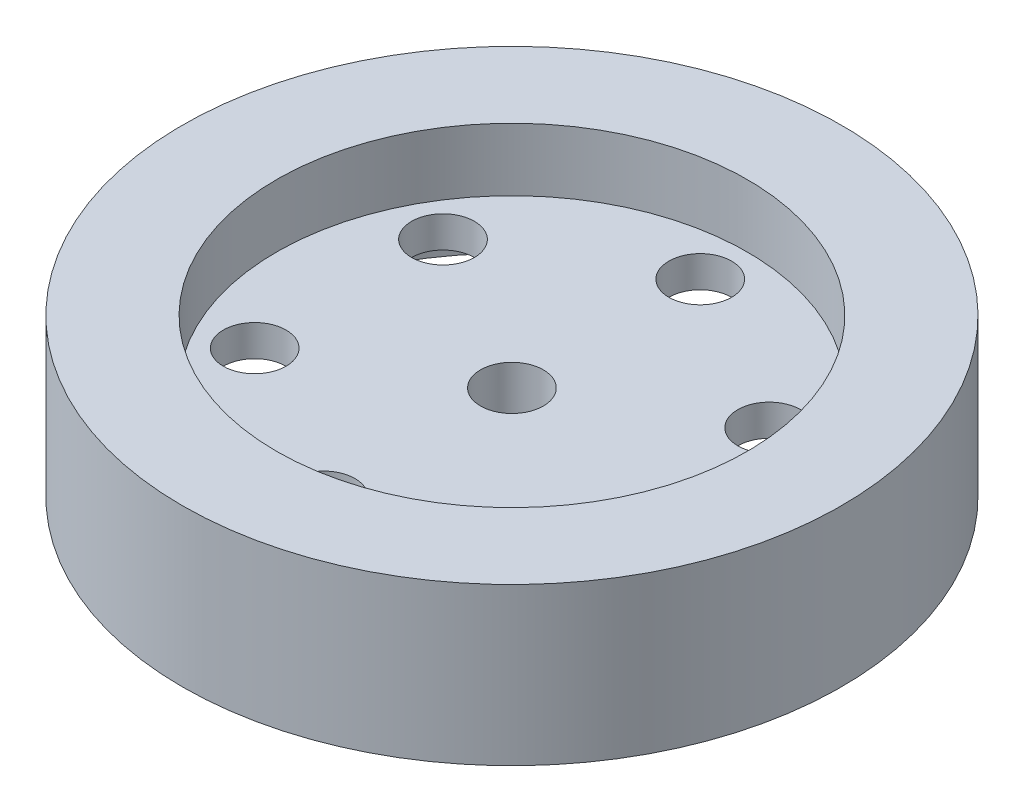
ISO-10303-21;
HEADER;
FILE_DESCRIPTION(('STEP AP214'),'2;1');
FILE_NAME('part.step','',(''),(''),'','','');
FILE_SCHEMA(('AUTOMOTIVE_DESIGN { 1 0 10303 214 1 1 1 1 }'));
ENDSEC;
DATA;
#1=APPLICATION_CONTEXT('core data for automotive mechanical design processes');
#2=APPLICATION_PROTOCOL_DEFINITION('international standard','automotive_design',2000,#1);
#3=PRODUCT_CONTEXT('',#1,'mechanical');
#4=PRODUCT('Part','Part','',(#3));
#5=PRODUCT_RELATED_PRODUCT_CATEGORY('part','',(#4));
#6=PRODUCT_DEFINITION_FORMATION('','',#4);
#7=PRODUCT_DEFINITION_CONTEXT('part definition',#1,'design');
#8=PRODUCT_DEFINITION('design','',#6,#7);
#9=PRODUCT_DEFINITION_SHAPE('','',#8);
#10=(LENGTH_UNIT() NAMED_UNIT(*) SI_UNIT(.MILLI.,.METRE.));
#11=(NAMED_UNIT(*) PLANE_ANGLE_UNIT() SI_UNIT($,.RADIAN.));
#12=(NAMED_UNIT(*) SI_UNIT($,.STERADIAN.) SOLID_ANGLE_UNIT());
#13=UNCERTAINTY_MEASURE_WITH_UNIT(LENGTH_MEASURE(1.E-05),#10,'distance_accuracy_value','');
#14=(GEOMETRIC_REPRESENTATION_CONTEXT(3) GLOBAL_UNCERTAINTY_ASSIGNED_CONTEXT((#13)) GLOBAL_UNIT_ASSIGNED_CONTEXT((#10,
#11,#12)) REPRESENTATION_CONTEXT('',''));
#15=CARTESIAN_POINT('',(0.,0.,0.));
#16=DIRECTION('',(0.,0.,1.));
#17=DIRECTION('',(1.,0.,0.));
#18=AXIS2_PLACEMENT_3D('',#15,#16,#17);
#19=CARTESIAN_POINT('',(0.,10.,0.));
#20=DIRECTION('',(0.,-1.,0.));
#21=DIRECTION('',(0.,0.,-1.));
#22=AXIS2_PLACEMENT_3D('',#19,#20,#21);
#23=CYLINDRICAL_SURFACE('',#22,21.);
#24=CARTESIAN_POINT('',(0.,10.,0.));
#25=DIRECTION('',(0.,1.,0.));
#26=DIRECTION('',(0.,0.,1.));
#27=AXIS2_PLACEMENT_3D('',#24,#25,#26);
#28=CIRCLE('',#27,21.);
#29=CARTESIAN_POINT('',(0.,10.,21.));
#30=VERTEX_POINT('',#29);
#31=EDGE_CURVE('E10',#30,#30,#28,.T.);
#32=ORIENTED_EDGE('',*,*,#31,.F.);
#33=EDGE_LOOP('',(#32));
#34=FACE_BOUND('',#33,.T.);
#35=CARTESIAN_POINT('',(0.,0.,0.));
#36=DIRECTION('',(0.,1.,0.));
#37=DIRECTION('',(0.,0.,1.));
#38=AXIS2_PLACEMENT_3D('',#35,#36,#37);
#39=CIRCLE('',#38,21.);
#40=CARTESIAN_POINT('',(0.,0.,21.));
#41=VERTEX_POINT('',#40);
#42=EDGE_CURVE('E34',#41,#41,#39,.T.);
#43=ORIENTED_EDGE('',*,*,#42,.T.);
#44=EDGE_LOOP('',(#43));
#45=FACE_BOUND('',#44,.T.);
#46=ADVANCED_FACE('F31',(#34,#45),#23,.T.);
#47=CARTESIAN_POINT('',(0.,10.,0.));
#48=DIRECTION('',(0.,1.,0.));
#49=DIRECTION('',(0.,0.,1.));
#50=AXIS2_PLACEMENT_3D('',#47,#48,#49);
#51=PLANE('',#50);
#52=CARTESIAN_POINT('',(0.,10.,0.));
#53=DIRECTION('',(0.,1.,0.));
#54=DIRECTION('',(0.,0.,1.));
#55=AXIS2_PLACEMENT_3D('',#52,#53,#54);
#56=CIRCLE('',#55,15.);
#57=CARTESIAN_POINT('',(0.,10.,15.));
#58=VERTEX_POINT('',#57);
#59=EDGE_CURVE('E43',#58,#58,#56,.T.);
#60=ORIENTED_EDGE('',*,*,#59,.F.);
#61=EDGE_LOOP('',(#60));
#62=FACE_BOUND('',#61,.T.);
#63=ORIENTED_EDGE('',*,*,#31,.T.);
#64=EDGE_LOOP('',(#63));
#65=FACE_BOUND('',#64,.T.);
#66=ADVANCED_FACE('F135',(#62,#65),#51,.T.);
#67=CARTESIAN_POINT('',(0.,0.,0.));
#68=DIRECTION('',(0.,1.,0.));
#69=DIRECTION('',(0.,0.,1.));
#70=AXIS2_PLACEMENT_3D('',#67,#68,#69);
#71=PLANE('',#70);
#72=CARTESIAN_POINT('',(0.,0.,0.));
#73=DIRECTION('',(0.,-1.,0.));
#74=DIRECTION('',(0.,0.,-1.));
#75=AXIS2_PLACEMENT_3D('',#72,#73,#74);
#76=CIRCLE('',#75,19.);
#77=CARTESIAN_POINT('',(0.,0.,-19.));
#78=VERTEX_POINT('',#77);
#79=EDGE_CURVE('E49',#78,#78,#76,.T.);
#80=ORIENTED_EDGE('',*,*,#79,.F.);
#81=EDGE_LOOP('',(#80));
#82=FACE_BOUND('',#81,.T.);
#83=ORIENTED_EDGE('',*,*,#42,.F.);
#84=EDGE_LOOP('',(#83));
#85=FACE_BOUND('',#84,.T.);
#86=ADVANCED_FACE('F131',(#82,#85),#71,.F.);
#87=CARTESIAN_POINT('',(0.,6.,0.));
#88=DIRECTION('',(0.,1.,0.));
#89=DIRECTION('',(0.,0.,1.));
#90=AXIS2_PLACEMENT_3D('',#87,#88,#89);
#91=CYLINDRICAL_SURFACE('',#90,15.);
#92=CARTESIAN_POINT('',(0.,6.,0.));
#93=DIRECTION('',(0.,1.,0.));
#94=DIRECTION('',(0.,0.,1.));
#95=AXIS2_PLACEMENT_3D('',#92,#93,#94);
#96=CIRCLE('',#95,15.);
#97=CARTESIAN_POINT('',(0.,6.,15.));
#98=VERTEX_POINT('',#97);
#99=EDGE_CURVE('E41',#98,#98,#96,.T.);
#100=ORIENTED_EDGE('',*,*,#99,.F.);
#101=EDGE_LOOP('',(#100));
#102=FACE_BOUND('',#101,.T.);
#103=ORIENTED_EDGE('',*,*,#59,.T.);
#104=EDGE_LOOP('',(#103));
#105=FACE_BOUND('',#104,.T.);
#106=ADVANCED_FACE('F134',(#102,#105),#91,.F.);
#107=CARTESIAN_POINT('',(0.,6.,0.));
#108=DIRECTION('',(0.,1.,0.));
#109=DIRECTION('',(0.,0.,1.));
#110=AXIS2_PLACEMENT_3D('',#107,#108,#109);
#111=PLANE('',#110);
#112=CARTESIAN_POINT('',(0.,6.,12.));
#113=DIRECTION('',(0.,1.,0.));
#114=DIRECTION('',(0.,0.,1.));
#115=AXIS2_PLACEMENT_3D('',#112,#113,#114);
#116=CIRCLE('',#115,2.);
#117=CARTESIAN_POINT('',(0.,6.,14.));
#118=VERTEX_POINT('',#117);
#119=EDGE_CURVE('E66',#118,#118,#116,.T.);
#120=ORIENTED_EDGE('',*,*,#119,.F.);
#121=EDGE_LOOP('',(#120));
#122=FACE_BOUND('',#121,.T.);
#123=CARTESIAN_POINT('',(-10.3923048454129,6.,5.9999999999994));
#124=DIRECTION('',(0.,1.,0.));
#125=DIRECTION('',(0.,0.,1.));
#126=AXIS2_PLACEMENT_3D('',#123,#124,#125);
#127=CIRCLE('',#126,2.00000000000064);
#128=CARTESIAN_POINT('',(-10.3923048454129,6.,8.00000000000004));
#129=VERTEX_POINT('',#128);
#130=EDGE_CURVE('E69',#129,#129,#127,.T.);
#131=ORIENTED_EDGE('',*,*,#130,.F.);
#132=EDGE_LOOP('',(#131));
#133=FACE_BOUND('',#132,.T.);
#134=CARTESIAN_POINT('',(-10.3923048454122,6.,-6.00000000000059));
#135=DIRECTION('',(0.,1.,0.));
#136=DIRECTION('',(0.,0.,1.));
#137=AXIS2_PLACEMENT_3D('',#134,#135,#136);
#138=CIRCLE('',#137,2.00000000000126);
#139=CARTESIAN_POINT('',(-10.3923048454122,6.,-3.99999999999934));
#140=VERTEX_POINT('',#139);
#141=EDGE_CURVE('E72',#140,#140,#138,.T.);
#142=ORIENTED_EDGE('',*,*,#141,.F.);
#143=EDGE_LOOP('',(#142));
#144=FACE_BOUND('',#143,.T.);
#145=CARTESIAN_POINT('',(1.35983332418246E-12,6.,-12.));
#146=DIRECTION('',(0.,1.,0.));
#147=DIRECTION('',(0.,0.,1.));
#148=AXIS2_PLACEMENT_3D('',#145,#146,#147);
#149=CIRCLE('',#148,2.00000000000138);
#150=CARTESIAN_POINT('',(1.35983332418246E-12,6.,-9.99999999999862));
#151=VERTEX_POINT('',#150);
#152=EDGE_CURVE('E75',#151,#151,#149,.T.);
#153=ORIENTED_EDGE('',*,*,#152,.F.);
#154=EDGE_LOOP('',(#153));
#155=FACE_BOUND('',#154,.T.);
#156=CARTESIAN_POINT('',(10.3923048454143,6.,-5.99999999999941));
#157=DIRECTION('',(0.,1.,0.));
#158=DIRECTION('',(0.,0.,1.));
#159=AXIS2_PLACEMENT_3D('',#156,#157,#158);
#160=CIRCLE('',#159,2.00000000000086);
#161=CARTESIAN_POINT('',(10.3923048454143,6.,-3.99999999999855));
#162=VERTEX_POINT('',#161);
#163=EDGE_CURVE('E78',#162,#162,#160,.T.);
#164=ORIENTED_EDGE('',*,*,#163,.F.);
#165=EDGE_LOOP('',(#164));
#166=FACE_BOUND('',#165,.T.);
#167=CARTESIAN_POINT('',(10.3923048454136,6.,6.00000000000059));
#168=DIRECTION('',(0.,1.,0.));
#169=DIRECTION('',(0.,0.,1.));
#170=AXIS2_PLACEMENT_3D('',#167,#168,#169);
#171=CIRCLE('',#170,2.00000000000019);
#172=CARTESIAN_POINT('',(10.3923048454136,6.,8.00000000000078));
#173=VERTEX_POINT('',#172);
#174=EDGE_CURVE('E81',#173,#173,#171,.T.);
#175=ORIENTED_EDGE('',*,*,#174,.F.);
#176=EDGE_LOOP('',(#175));
#177=FACE_BOUND('',#176,.T.);
#178=CARTESIAN_POINT('',(0.,6.,0.));
#179=DIRECTION('',(0.,1.,0.));
#180=DIRECTION('',(0.,0.,1.));
#181=AXIS2_PLACEMENT_3D('',#178,#179,#180);
#182=CIRCLE('',#181,2.);
#183=CARTESIAN_POINT('',(0.,6.,2.));
#184=VERTEX_POINT('',#183);
#185=EDGE_CURVE('E58',#184,#184,#182,.T.);
#186=ORIENTED_EDGE('',*,*,#185,.F.);
#187=EDGE_LOOP('',(#186));
#188=FACE_BOUND('',#187,.T.);
#189=ORIENTED_EDGE('',*,*,#99,.T.);
#190=EDGE_LOOP('',(#189));
#191=FACE_BOUND('',#190,.T.);
#192=ADVANCED_FACE('F127',(#122,#133,#144,#155,#166,#177,#188,#191),#111,.T.);
#193=CARTESIAN_POINT('',(0.,4.,0.));
#194=DIRECTION('',(0.,-1.,0.));
#195=DIRECTION('',(0.,0.,-1.));
#196=AXIS2_PLACEMENT_3D('',#193,#194,#195);
#197=CYLINDRICAL_SURFACE('',#196,19.);
#198=CARTESIAN_POINT('',(0.,4.,0.));
#199=DIRECTION('',(0.,-1.,0.));
#200=DIRECTION('',(0.,0.,-1.));
#201=AXIS2_PLACEMENT_3D('',#198,#199,#200);
#202=CIRCLE('',#201,19.);
#203=CARTESIAN_POINT('',(0.,4.,-19.));
#204=VERTEX_POINT('',#203);
#205=EDGE_CURVE('E46',#204,#204,#202,.T.);
#206=ORIENTED_EDGE('',*,*,#205,.F.);
#207=EDGE_LOOP('',(#206));
#208=FACE_BOUND('',#207,.T.);
#209=ORIENTED_EDGE('',*,*,#79,.T.);
#210=EDGE_LOOP('',(#209));
#211=FACE_BOUND('',#210,.T.);
#212=ADVANCED_FACE('F109',(#208,#211),#197,.F.);
#213=CARTESIAN_POINT('',(0.,4.,0.));
#214=DIRECTION('',(0.,-1.,0.));
#215=DIRECTION('',(0.,0.,-1.));
#216=AXIS2_PLACEMENT_3D('',#213,#214,#215);
#217=PLANE('',#216);
#218=CARTESIAN_POINT('',(0.,4.,12.));
#219=DIRECTION('',(0.,-1.,0.));
#220=DIRECTION('',(0.,0.,-1.));
#221=AXIS2_PLACEMENT_3D('',#218,#219,#220);
#222=CIRCLE('',#221,2.);
#223=CARTESIAN_POINT('',(0.,4.,10.));
#224=VERTEX_POINT('',#223);
#225=EDGE_CURVE('E84',#224,#224,#222,.T.);
#226=ORIENTED_EDGE('',*,*,#225,.F.);
#227=EDGE_LOOP('',(#226));
#228=FACE_BOUND('',#227,.T.);
#229=CARTESIAN_POINT('',(-10.3923048454129,4.,5.9999999999994));
#230=DIRECTION('',(0.,-1.,0.));
#231=DIRECTION('',(0.,0.,-1.));
#232=AXIS2_PLACEMENT_3D('',#229,#230,#231);
#233=CIRCLE('',#232,2.00000000000064);
#234=CARTESIAN_POINT('',(-10.3923048454129,4.,3.99999999999876));
#235=VERTEX_POINT('',#234);
#236=EDGE_CURVE('E89',#235,#235,#233,.T.);
#237=ORIENTED_EDGE('',*,*,#236,.F.);
#238=EDGE_LOOP('',(#237));
#239=FACE_BOUND('',#238,.T.);
#240=CARTESIAN_POINT('',(-10.3923048454122,4.,-6.00000000000059));
#241=DIRECTION('',(0.,-1.,0.));
#242=DIRECTION('',(0.,0.,-1.));
#243=AXIS2_PLACEMENT_3D('',#240,#241,#242);
#244=CIRCLE('',#243,2.00000000000126);
#245=CARTESIAN_POINT('',(-10.3923048454122,4.,-8.00000000000185));
#246=VERTEX_POINT('',#245);
#247=EDGE_CURVE('E85',#246,#246,#244,.T.);
#248=ORIENTED_EDGE('',*,*,#247,.F.);
#249=EDGE_LOOP('',(#248));
#250=FACE_BOUND('',#249,.T.);
#251=CARTESIAN_POINT('',(1.35983332418246E-12,4.,-12.));
#252=DIRECTION('',(0.,-1.,0.));
#253=DIRECTION('',(0.,0.,-1.));
#254=AXIS2_PLACEMENT_3D('',#251,#252,#253);
#255=CIRCLE('',#254,2.00000000000138);
#256=CARTESIAN_POINT('',(1.35983332418246E-12,4.,-14.0000000000014));
#257=VERTEX_POINT('',#256);
#258=EDGE_CURVE('E88',#257,#257,#255,.T.);
#259=ORIENTED_EDGE('',*,*,#258,.F.);
#260=EDGE_LOOP('',(#259));
#261=FACE_BOUND('',#260,.T.);
#262=CARTESIAN_POINT('',(10.3923048454143,4.,-5.99999999999941));
#263=DIRECTION('',(0.,-1.,0.));
#264=DIRECTION('',(0.,0.,-1.));
#265=AXIS2_PLACEMENT_3D('',#262,#263,#264);
#266=CIRCLE('',#265,2.00000000000086);
#267=CARTESIAN_POINT('',(10.3923048454143,4.,-8.00000000000027));
#268=VERTEX_POINT('',#267);
#269=EDGE_CURVE('E92',#268,#268,#266,.T.);
#270=ORIENTED_EDGE('',*,*,#269,.F.);
#271=EDGE_LOOP('',(#270));
#272=FACE_BOUND('',#271,.T.);
#273=CARTESIAN_POINT('',(10.3923048454136,4.,6.00000000000059));
#274=DIRECTION('',(0.,-1.,0.));
#275=DIRECTION('',(0.,0.,-1.));
#276=AXIS2_PLACEMENT_3D('',#273,#274,#275);
#277=CIRCLE('',#276,2.00000000000019);
#278=CARTESIAN_POINT('',(10.3923048454136,4.,4.00000000000041));
#279=VERTEX_POINT('',#278);
#280=EDGE_CURVE('E95',#279,#279,#277,.T.);
#281=ORIENTED_EDGE('',*,*,#280,.F.);
#282=EDGE_LOOP('',(#281));
#283=FACE_BOUND('',#282,.T.);
#284=CARTESIAN_POINT('',(0.,4.,0.));
#285=DIRECTION('',(0.,-1.,0.));
#286=DIRECTION('',(0.,0.,-1.));
#287=AXIS2_PLACEMENT_3D('',#284,#285,#286);
#288=CIRCLE('',#287,5.);
#289=CARTESIAN_POINT('',(0.,4.,-5.));
#290=VERTEX_POINT('',#289);
#291=EDGE_CURVE('E52',#290,#290,#288,.T.);
#292=ORIENTED_EDGE('',*,*,#291,.F.);
#293=EDGE_LOOP('',(#292));
#294=FACE_BOUND('',#293,.T.);
#295=ORIENTED_EDGE('',*,*,#205,.T.);
#296=EDGE_LOOP('',(#295));
#297=FACE_BOUND('',#296,.T.);
#298=ADVANCED_FACE('F105',(#228,#239,#250,#261,#272,#283,#294,#297),#217,.T.);
#299=CARTESIAN_POINT('',(0.,4.,0.));
#300=DIRECTION('',(0.,-1.,0.));
#301=DIRECTION('',(0.,0.,-1.));
#302=AXIS2_PLACEMENT_3D('',#299,#300,#301);
#303=CYLINDRICAL_SURFACE('',#302,5.);
#304=ORIENTED_EDGE('',*,*,#291,.T.);
#305=EDGE_LOOP('',(#304));
#306=FACE_BOUND('',#305,.T.);
#307=CARTESIAN_POINT('',(0.,0.,0.));
#308=DIRECTION('',(0.,-1.,0.));
#309=DIRECTION('',(0.,0.,-1.));
#310=AXIS2_PLACEMENT_3D('',#307,#308,#309);
#311=CIRCLE('',#310,5.);
#312=CARTESIAN_POINT('',(0.,0.,-5.));
#313=VERTEX_POINT('',#312);
#314=EDGE_CURVE('E55',#313,#313,#311,.T.);
#315=ORIENTED_EDGE('',*,*,#314,.F.);
#316=EDGE_LOOP('',(#315));
#317=FACE_BOUND('',#316,.T.);
#318=ADVANCED_FACE('F108',(#306,#317),#303,.T.);
#319=CARTESIAN_POINT('',(0.,0.,0.));
#320=DIRECTION('',(0.,-1.,0.));
#321=DIRECTION('',(0.,0.,-1.));
#322=AXIS2_PLACEMENT_3D('',#319,#320,#321);
#323=CIRCLE('',#322,2.);
#324=CARTESIAN_POINT('',(0.,0.,-2.));
#325=VERTEX_POINT('',#324);
#326=EDGE_CURVE('E63',#325,#325,#323,.T.);
#327=ORIENTED_EDGE('',*,*,#326,.F.);
#328=EDGE_LOOP('',(#327));
#329=FACE_BOUND('',#328,.T.);
#330=ORIENTED_EDGE('',*,*,#314,.T.);
#331=EDGE_LOOP('',(#330));
#332=FACE_BOUND('',#331,.T.);
#333=ADVANCED_FACE('F136',(#329,#332),#71,.F.);
#334=CARTESIAN_POINT('',(0.,10.,0.));
#335=DIRECTION('',(0.,-1.,0.));
#336=DIRECTION('',(0.,0.,-1.));
#337=AXIS2_PLACEMENT_3D('',#334,#335,#336);
#338=CYLINDRICAL_SURFACE('',#337,2.);
#339=ORIENTED_EDGE('',*,*,#185,.T.);
#340=EDGE_LOOP('',(#339));
#341=FACE_BOUND('',#340,.T.);
#342=ORIENTED_EDGE('',*,*,#326,.T.);
#343=EDGE_LOOP('',(#342));
#344=FACE_BOUND('',#343,.T.);
#345=ADVANCED_FACE('F159',(#341,#344),#338,.F.);
#346=CARTESIAN_POINT('',(10.3923048454136,10.,6.00000000000059));
#347=DIRECTION('',(0.,-1.,0.));
#348=DIRECTION('',(0.,0.,-1.));
#349=AXIS2_PLACEMENT_3D('',#346,#347,#348);
#350=CYLINDRICAL_SURFACE('',#349,2.00000000000019);
#351=ORIENTED_EDGE('',*,*,#174,.T.);
#352=EDGE_LOOP('',(#351));
#353=FACE_BOUND('',#352,.T.);
#354=ORIENTED_EDGE('',*,*,#280,.T.);
#355=EDGE_LOOP('',(#354));
#356=FACE_BOUND('',#355,.T.);
#357=ADVANCED_FACE('F162',(#353,#356),#350,.F.);
#358=CARTESIAN_POINT('',(10.3923048454143,10.,-5.99999999999941));
#359=DIRECTION('',(0.,-1.,0.));
#360=DIRECTION('',(0.,0.,-1.));
#361=AXIS2_PLACEMENT_3D('',#358,#359,#360);
#362=CYLINDRICAL_SURFACE('',#361,2.00000000000086);
#363=ORIENTED_EDGE('',*,*,#163,.T.);
#364=EDGE_LOOP('',(#363));
#365=FACE_BOUND('',#364,.T.);
#366=ORIENTED_EDGE('',*,*,#269,.T.);
#367=EDGE_LOOP('',(#366));
#368=FACE_BOUND('',#367,.T.);
#369=ADVANCED_FACE('F172',(#365,#368),#362,.F.);
#370=CARTESIAN_POINT('',(1.35983332418246E-12,10.,-12.));
#371=DIRECTION('',(0.,-1.,0.));
#372=DIRECTION('',(0.,0.,-1.));
#373=AXIS2_PLACEMENT_3D('',#370,#371,#372);
#374=CYLINDRICAL_SURFACE('',#373,2.00000000000138);
#375=ORIENTED_EDGE('',*,*,#152,.T.);
#376=EDGE_LOOP('',(#375));
#377=FACE_BOUND('',#376,.T.);
#378=ORIENTED_EDGE('',*,*,#258,.T.);
#379=EDGE_LOOP('',(#378));
#380=FACE_BOUND('',#379,.T.);
#381=ADVANCED_FACE('F168',(#377,#380),#374,.F.);
#382=CARTESIAN_POINT('',(-10.3923048454122,10.,-6.00000000000059));
#383=DIRECTION('',(0.,-1.,0.));
#384=DIRECTION('',(0.,0.,-1.));
#385=AXIS2_PLACEMENT_3D('',#382,#383,#384);
#386=CYLINDRICAL_SURFACE('',#385,2.00000000000126);
#387=ORIENTED_EDGE('',*,*,#141,.T.);
#388=EDGE_LOOP('',(#387));
#389=FACE_BOUND('',#388,.T.);
#390=ORIENTED_EDGE('',*,*,#247,.T.);
#391=EDGE_LOOP('',(#390));
#392=FACE_BOUND('',#391,.T.);
#393=ADVANCED_FACE('F164',(#389,#392),#386,.F.);
#394=CARTESIAN_POINT('',(-10.3923048454129,10.,5.9999999999994));
#395=DIRECTION('',(0.,-1.,0.));
#396=DIRECTION('',(0.,0.,-1.));
#397=AXIS2_PLACEMENT_3D('',#394,#395,#396);
#398=CYLINDRICAL_SURFACE('',#397,2.00000000000064);
#399=ORIENTED_EDGE('',*,*,#130,.T.);
#400=EDGE_LOOP('',(#399));
#401=FACE_BOUND('',#400,.T.);
#402=ORIENTED_EDGE('',*,*,#236,.T.);
#403=EDGE_LOOP('',(#402));
#404=FACE_BOUND('',#403,.T.);
#405=ADVANCED_FACE('F167',(#401,#404),#398,.F.);
#406=CARTESIAN_POINT('',(0.,10.,12.));
#407=DIRECTION('',(0.,-1.,0.));
#408=DIRECTION('',(0.,0.,-1.));
#409=AXIS2_PLACEMENT_3D('',#406,#407,#408);
#410=CYLINDRICAL_SURFACE('',#409,2.);
#411=ORIENTED_EDGE('',*,*,#119,.T.);
#412=EDGE_LOOP('',(#411));
#413=FACE_BOUND('',#412,.T.);
#414=ORIENTED_EDGE('',*,*,#225,.T.);
#415=EDGE_LOOP('',(#414));
#416=FACE_BOUND('',#415,.T.);
#417=ADVANCED_FACE('F103',(#413,#416),#410,.F.);
#418=CLOSED_SHELL('',(#46,#66,#86,#106,#192,#212,#298,#318,#333,#345,#357,#369,#381,#393,#405,#417));
#419=MANIFOLD_SOLID_BREP('B2',#418);
#420=ADVANCED_BREP_SHAPE_REPRESENTATION('',(#18,#419),#14);
#421=SHAPE_DEFINITION_REPRESENTATION(#9,#420);
ENDSEC;
END-ISO-10303-21;
